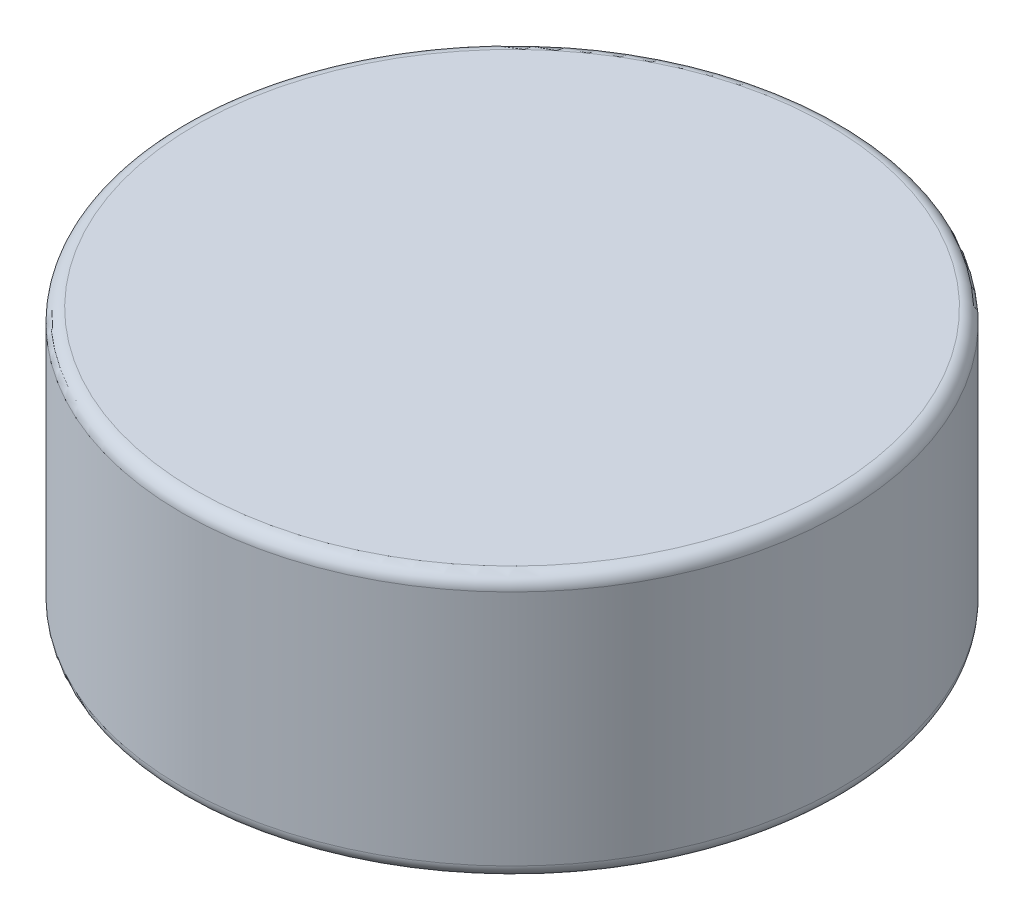
ISO-10303-21;
HEADER;
FILE_DESCRIPTION(('STEP AP214'),'2;1');
FILE_NAME('part.step','',(''),(''),'','','');
FILE_SCHEMA(('AUTOMOTIVE_DESIGN { 1 0 10303 214 1 1 1 1 }'));
ENDSEC;
DATA;
#1=APPLICATION_CONTEXT('core data for automotive mechanical design processes');
#2=APPLICATION_PROTOCOL_DEFINITION('international standard','automotive_design',2000,#1);
#3=PRODUCT_CONTEXT('',#1,'mechanical');
#4=PRODUCT('Part','Part','',(#3));
#5=PRODUCT_RELATED_PRODUCT_CATEGORY('part','',(#4));
#6=PRODUCT_DEFINITION_FORMATION('','',#4);
#7=PRODUCT_DEFINITION_CONTEXT('part definition',#1,'design');
#8=PRODUCT_DEFINITION('design','',#6,#7);
#9=PRODUCT_DEFINITION_SHAPE('','',#8);
#10=(LENGTH_UNIT() NAMED_UNIT(*) SI_UNIT(.MILLI.,.METRE.));
#11=(NAMED_UNIT(*) PLANE_ANGLE_UNIT() SI_UNIT($,.RADIAN.));
#12=(NAMED_UNIT(*) SI_UNIT($,.STERADIAN.) SOLID_ANGLE_UNIT());
#13=UNCERTAINTY_MEASURE_WITH_UNIT(LENGTH_MEASURE(1.E-05),#10,'distance_accuracy_value','');
#14=(GEOMETRIC_REPRESENTATION_CONTEXT(3) GLOBAL_UNCERTAINTY_ASSIGNED_CONTEXT((#13)) GLOBAL_UNIT_ASSIGNED_CONTEXT((#10,
#11,#12)) REPRESENTATION_CONTEXT('',''));
#15=CARTESIAN_POINT('',(0.,0.,0.));
#16=DIRECTION('',(0.,0.,1.));
#17=DIRECTION('',(1.,0.,0.));
#18=AXIS2_PLACEMENT_3D('',#15,#16,#17);
#19=CARTESIAN_POINT('',(0.,-20.,0.));
#20=DIRECTION('',(0.,1.,0.));
#21=DIRECTION('',(0.,0.,1.));
#22=AXIS2_PLACEMENT_3D('',#19,#20,#21);
#23=CYLINDRICAL_SURFACE('',#22,25.);
#24=CARTESIAN_POINT('',(0.,-19.,0.));
#25=DIRECTION('',(0.,1.,0.));
#26=DIRECTION('',(0.,0.,1.));
#27=AXIS2_PLACEMENT_3D('',#24,#25,#26);
#28=CIRCLE('',#27,25.);
#29=CARTESIAN_POINT('',(0.,-19.,25.));
#30=VERTEX_POINT('',#29);
#31=EDGE_CURVE('E42',#30,#30,#28,.T.);
#32=ORIENTED_EDGE('',*,*,#31,.T.);
#33=EDGE_LOOP('',(#32));
#34=FACE_BOUND('',#33,.T.);
#35=CARTESIAN_POINT('',(0.,-1.,0.));
#36=DIRECTION('',(0.,1.,0.));
#37=DIRECTION('',(0.,0.,1.));
#38=AXIS2_PLACEMENT_3D('',#35,#36,#37);
#39=CIRCLE('',#38,25.);
#40=CARTESIAN_POINT('',(0.,-1.,25.));
#41=VERTEX_POINT('',#40);
#42=EDGE_CURVE('E46',#41,#41,#39,.F.);
#43=ORIENTED_EDGE('',*,*,#42,.T.);
#44=EDGE_LOOP('',(#43));
#45=FACE_BOUND('',#44,.T.);
#46=ADVANCED_FACE('F31',(#34,#45),#23,.T.);
#47=CARTESIAN_POINT('',(0.,-20.,0.));
#48=DIRECTION('',(0.,1.,0.));
#49=DIRECTION('',(0.,0.,1.));
#50=AXIS2_PLACEMENT_3D('',#47,#48,#49);
#51=PLANE('',#50);
#52=CARTESIAN_POINT('',(0.,-20.,0.));
#53=DIRECTION('',(0.,-1.,0.));
#54=DIRECTION('',(0.,0.,-1.));
#55=AXIS2_PLACEMENT_3D('',#52,#53,#54);
#56=CIRCLE('',#55,3.);
#57=CARTESIAN_POINT('',(0.,-20.,-3.));
#58=VERTEX_POINT('',#57);
#59=EDGE_CURVE('E52',#58,#58,#56,.T.);
#60=ORIENTED_EDGE('',*,*,#59,.F.);
#61=EDGE_LOOP('',(#60));
#62=FACE_BOUND('',#61,.T.);
#63=CARTESIAN_POINT('',(0.,-20.,0.));
#64=DIRECTION('',(0.,1.,0.));
#65=DIRECTION('',(0.,0.,1.));
#66=AXIS2_PLACEMENT_3D('',#63,#64,#65);
#67=CIRCLE('',#66,24.);
#68=CARTESIAN_POINT('',(0.,-20.,24.));
#69=VERTEX_POINT('',#68);
#70=EDGE_CURVE('E38',#69,#69,#67,.F.);
#71=ORIENTED_EDGE('',*,*,#70,.T.);
#72=EDGE_LOOP('',(#71));
#73=FACE_BOUND('',#72,.T.);
#74=ADVANCED_FACE('F66',(#62,#73),#51,.F.);
#75=CARTESIAN_POINT('',(0.,0.,0.));
#76=DIRECTION('',(0.,1.,0.));
#77=DIRECTION('',(0.,0.,1.));
#78=AXIS2_PLACEMENT_3D('',#75,#76,#77);
#79=PLANE('',#78);
#80=CARTESIAN_POINT('',(0.,0.,0.));
#81=DIRECTION('',(0.,1.,0.));
#82=DIRECTION('',(0.,0.,1.));
#83=AXIS2_PLACEMENT_3D('',#80,#81,#82);
#84=CIRCLE('',#83,24.);
#85=CARTESIAN_POINT('',(0.,0.,24.));
#86=VERTEX_POINT('',#85);
#87=EDGE_CURVE('E10',#86,#86,#84,.T.);
#88=ORIENTED_EDGE('',*,*,#87,.T.);
#89=EDGE_LOOP('',(#88));
#90=FACE_BOUND('',#89,.T.);
#91=ADVANCED_FACE('F68',(#90),#79,.T.);
#92=CARTESIAN_POINT('',(0.,-19.,0.));
#93=DIRECTION('',(0.,1.,0.));
#94=DIRECTION('',(0.,0.,1.));
#95=AXIS2_PLACEMENT_3D('',#92,#93,#94);
#96=TOROIDAL_SURFACE('',#95,24.,1.);
#97=ORIENTED_EDGE('',*,*,#70,.F.);
#98=EDGE_LOOP('',(#97));
#99=FACE_BOUND('',#98,.T.);
#100=ORIENTED_EDGE('',*,*,#31,.F.);
#101=EDGE_LOOP('',(#100));
#102=FACE_BOUND('',#101,.T.);
#103=ADVANCED_FACE('F74',(#99,#102),#96,.T.);
#104=CARTESIAN_POINT('',(0.,-1.,0.));
#105=DIRECTION('',(0.,1.,0.));
#106=DIRECTION('',(0.,0.,1.));
#107=AXIS2_PLACEMENT_3D('',#104,#105,#106);
#108=TOROIDAL_SURFACE('',#107,24.,1.);
#109=ORIENTED_EDGE('',*,*,#42,.F.);
#110=EDGE_LOOP('',(#109));
#111=FACE_BOUND('',#110,.T.);
#112=ORIENTED_EDGE('',*,*,#87,.F.);
#113=EDGE_LOOP('',(#112));
#114=FACE_BOUND('',#113,.T.);
#115=ADVANCED_FACE('F33',(#111,#114),#108,.T.);
#116=CARTESIAN_POINT('',(0.,-7.5,0.));
#117=DIRECTION('',(0.,-1.,0.));
#118=DIRECTION('',(0.,0.,-1.));
#119=AXIS2_PLACEMENT_3D('',#116,#117,#118);
#120=CYLINDRICAL_SURFACE('',#119,3.);
#121=CARTESIAN_POINT('',(0.,-7.5,0.));
#122=DIRECTION('',(0.,-1.,0.));
#123=DIRECTION('',(0.,0.,-1.));
#124=AXIS2_PLACEMENT_3D('',#121,#122,#123);
#125=CIRCLE('',#124,3.);
#126=CARTESIAN_POINT('',(0.,-7.5,-3.));
#127=VERTEX_POINT('',#126);
#128=EDGE_CURVE('E51',#127,#127,#125,.T.);
#129=ORIENTED_EDGE('',*,*,#128,.F.);
#130=EDGE_LOOP('',(#129));
#131=FACE_BOUND('',#130,.T.);
#132=ORIENTED_EDGE('',*,*,#59,.T.);
#133=EDGE_LOOP('',(#132));
#134=FACE_BOUND('',#133,.T.);
#135=ADVANCED_FACE('F60',(#131,#134),#120,.F.);
#136=CARTESIAN_POINT('',(0.,-7.5,0.));
#137=DIRECTION('',(0.,-1.,0.));
#138=DIRECTION('',(0.,0.,-1.));
#139=AXIS2_PLACEMENT_3D('',#136,#137,#138);
#140=PLANE('',#139);
#141=ORIENTED_EDGE('',*,*,#128,.T.);
#142=EDGE_LOOP('',(#141));
#143=FACE_BOUND('',#142,.T.);
#144=ADVANCED_FACE('F58',(#143),#140,.T.);
#145=CLOSED_SHELL('',(#46,#74,#91,#103,#115,#135,#144));
#146=MANIFOLD_SOLID_BREP('B2',#145);
#147=ADVANCED_BREP_SHAPE_REPRESENTATION('',(#18,#146),#14);
#148=SHAPE_DEFINITION_REPRESENTATION(#9,#147);
ENDSEC;
END-ISO-10303-21;
